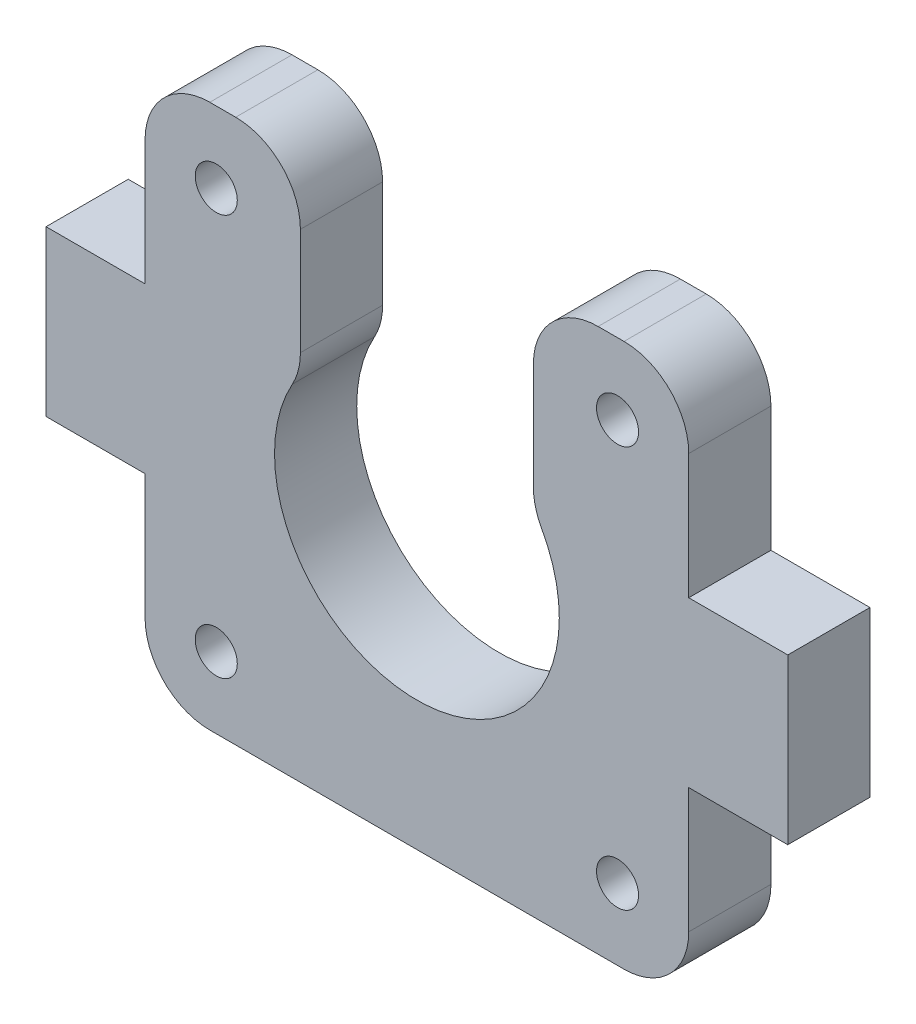
ISO-10303-21;
HEADER;
FILE_DESCRIPTION(('STEP AP214'),'2;1');
FILE_NAME('part.step','',(''),(''),'','','');
FILE_SCHEMA(('AUTOMOTIVE_DESIGN { 1 0 10303 214 1 1 1 1 }'));
ENDSEC;
DATA;
#1=APPLICATION_CONTEXT('core data for automotive mechanical design processes');
#2=APPLICATION_PROTOCOL_DEFINITION('international standard','automotive_design',2000,#1);
#3=PRODUCT_CONTEXT('',#1,'mechanical');
#4=PRODUCT('Part','Part','',(#3));
#5=PRODUCT_RELATED_PRODUCT_CATEGORY('part','',(#4));
#6=PRODUCT_DEFINITION_FORMATION('','',#4);
#7=PRODUCT_DEFINITION_CONTEXT('part definition',#1,'design');
#8=PRODUCT_DEFINITION('design','',#6,#7);
#9=PRODUCT_DEFINITION_SHAPE('','',#8);
#10=(LENGTH_UNIT() NAMED_UNIT(*) SI_UNIT(.MILLI.,.METRE.));
#11=(NAMED_UNIT(*) PLANE_ANGLE_UNIT() SI_UNIT($,.RADIAN.));
#12=(NAMED_UNIT(*) SI_UNIT($,.STERADIAN.) SOLID_ANGLE_UNIT());
#13=UNCERTAINTY_MEASURE_WITH_UNIT(LENGTH_MEASURE(1.E-05),#10,'distance_accuracy_value','');
#14=(GEOMETRIC_REPRESENTATION_CONTEXT(3) GLOBAL_UNCERTAINTY_ASSIGNED_CONTEXT((#13)) GLOBAL_UNIT_ASSIGNED_CONTEXT((#10,
#11,#12)) REPRESENTATION_CONTEXT('',''));
#15=CARTESIAN_POINT('',(0.,0.,0.));
#16=DIRECTION('',(0.,0.,1.));
#17=DIRECTION('',(1.,0.,0.));
#18=AXIS2_PLACEMENT_3D('',#15,#16,#17);
#19=CARTESIAN_POINT('',(0.,0.,6.35));
#20=DIRECTION('',(0.,0.,1.));
#21=DIRECTION('',(1.,0.,0.));
#22=AXIS2_PLACEMENT_3D('',#19,#20,#21);
#23=PLANE('',#22);
#24=CARTESIAN_POINT('',(15.5,15.5,6.35));
#25=DIRECTION('',(0.,0.,1.));
#26=DIRECTION('',(1.,0.,0.));
#27=AXIS2_PLACEMENT_3D('',#24,#25,#26);
#28=CIRCLE('',#27,1.625);
#29=CARTESIAN_POINT('',(17.125,15.5,6.35));
#30=VERTEX_POINT('',#29);
#31=EDGE_CURVE('E279',#30,#30,#28,.T.);
#32=ORIENTED_EDGE('',*,*,#31,.F.);
#33=EDGE_LOOP('',(#32));
#34=FACE_BOUND('',#33,.T.);
#35=CARTESIAN_POINT('',(15.5,-15.5,6.35));
#36=DIRECTION('',(0.,0.,1.));
#37=DIRECTION('',(1.,0.,0.));
#38=AXIS2_PLACEMENT_3D('',#35,#36,#37);
#39=CIRCLE('',#38,1.625);
#40=CARTESIAN_POINT('',(17.125,-15.5,6.35));
#41=VERTEX_POINT('',#40);
#42=EDGE_CURVE('E291',#41,#41,#39,.T.);
#43=ORIENTED_EDGE('',*,*,#42,.F.);
#44=EDGE_LOOP('',(#43));
#45=FACE_BOUND('',#44,.T.);
#46=CARTESIAN_POINT('',(-15.5,15.5,6.35));
#47=DIRECTION('',(0.,0.,1.));
#48=DIRECTION('',(1.,0.,0.));
#49=AXIS2_PLACEMENT_3D('',#46,#47,#48);
#50=CIRCLE('',#49,1.625);
#51=CARTESIAN_POINT('',(-13.875,15.5,6.35));
#52=VERTEX_POINT('',#51);
#53=EDGE_CURVE('E297',#52,#52,#50,.T.);
#54=ORIENTED_EDGE('',*,*,#53,.F.);
#55=EDGE_LOOP('',(#54));
#56=FACE_BOUND('',#55,.T.);
#57=CARTESIAN_POINT('',(-15.5,-15.5,6.35));
#58=DIRECTION('',(0.,0.,1.));
#59=DIRECTION('',(1.,0.,0.));
#60=AXIS2_PLACEMENT_3D('',#57,#58,#59);
#61=CIRCLE('',#60,1.625);
#62=CARTESIAN_POINT('',(-13.875,-15.5,6.35));
#63=VERTEX_POINT('',#62);
#64=EDGE_CURVE('E303',#63,#63,#61,.T.);
#65=ORIENTED_EDGE('',*,*,#64,.F.);
#66=EDGE_LOOP('',(#65));
#67=FACE_BOUND('',#66,.T.);
#68=DIRECTION('',(-1.,0.,0.));
#69=VECTOR('',#68,1.);
#70=CARTESIAN_POINT('',(28.65,21.,6.35));
#71=LINE('',#70,#69);
#72=CARTESIAN_POINT('',(16.,21.,6.35));
#73=VERTEX_POINT('',#72);
#74=CARTESIAN_POINT('',(14.,21.,6.35));
#75=VERTEX_POINT('',#74);
#76=EDGE_CURVE('E323',#73,#75,#71,.T.);
#77=ORIENTED_EDGE('',*,*,#76,.T.);
#78=CARTESIAN_POINT('',(14.,16.,6.35));
#79=DIRECTION('',(0.,0.,1.));
#80=DIRECTION('',(1.,0.,0.));
#81=AXIS2_PLACEMENT_3D('',#78,#79,#80);
#82=CIRCLE('',#81,5.);
#83=CARTESIAN_POINT('',(9.,16.,6.35));
#84=VERTEX_POINT('',#83);
#85=EDGE_CURVE('E353',#75,#84,#82,.T.);
#86=ORIENTED_EDGE('',*,*,#85,.T.);
#87=DIRECTION('',(0.,1.,0.));
#88=VECTOR('',#87,1.);
#89=CARTESIAN_POINT('',(9.,0.,6.35));
#90=LINE('',#89,#88);
#91=CARTESIAN_POINT('',(9.,7.74596669241484,6.35));
#92=VERTEX_POINT('',#91);
#93=EDGE_CURVE('E281',#92,#84,#90,.T.);
#94=ORIENTED_EDGE('',*,*,#93,.F.);
#95=CARTESIAN_POINT('',(14.,7.74596669241484,6.35));
#96=DIRECTION('',(0.,0.,1.));
#97=DIRECTION('',(1.,0.,0.));
#98=AXIS2_PLACEMENT_3D('',#95,#96,#97);
#99=CIRCLE('',#98,5.);
#100=CARTESIAN_POINT('',(9.625,5.3253521010352,6.35));
#101=VERTEX_POINT('',#100);
#102=EDGE_CURVE('E347',#92,#101,#99,.T.);
#103=ORIENTED_EDGE('',*,*,#102,.T.);
#104=CARTESIAN_POINT('',(0.,0.,6.35));
#105=DIRECTION('',(0.,0.,1.));
#106=DIRECTION('',(1.,0.,0.));
#107=AXIS2_PLACEMENT_3D('',#104,#105,#106);
#108=CIRCLE('',#107,11.);
#109=CARTESIAN_POINT('',(-9.625,5.3253521010352,6.35));
#110=VERTEX_POINT('',#109);
#111=EDGE_CURVE('E256',#110,#101,#108,.T.);
#112=ORIENTED_EDGE('',*,*,#111,.F.);
#113=CARTESIAN_POINT('',(-14.,7.74596669241484,6.35));
#114=DIRECTION('',(0.,0.,1.));
#115=DIRECTION('',(1.,0.,0.));
#116=AXIS2_PLACEMENT_3D('',#113,#114,#115);
#117=CIRCLE('',#116,5.);
#118=CARTESIAN_POINT('',(-9.,7.74596669241484,6.35));
#119=VERTEX_POINT('',#118);
#120=EDGE_CURVE('E349',#110,#119,#117,.T.);
#121=ORIENTED_EDGE('',*,*,#120,.T.);
#122=DIRECTION('',(0.,1.,0.));
#123=VECTOR('',#122,1.);
#124=CARTESIAN_POINT('',(-9.,0.,6.35));
#125=LINE('',#124,#123);
#126=CARTESIAN_POINT('',(-9.,16.,6.35));
#127=VERTEX_POINT('',#126);
#128=EDGE_CURVE('E274',#119,#127,#125,.T.);
#129=ORIENTED_EDGE('',*,*,#128,.T.);
#130=CARTESIAN_POINT('',(-14.,16.,6.35));
#131=DIRECTION('',(0.,0.,1.));
#132=DIRECTION('',(1.,0.,0.));
#133=AXIS2_PLACEMENT_3D('',#130,#131,#132);
#134=CIRCLE('',#133,5.);
#135=CARTESIAN_POINT('',(-14.,21.,6.35));
#136=VERTEX_POINT('',#135);
#137=EDGE_CURVE('E351',#127,#136,#134,.T.);
#138=ORIENTED_EDGE('',*,*,#137,.T.);
#139=CARTESIAN_POINT('',(-16.,21.,6.35));
#140=VERTEX_POINT('',#139);
#141=EDGE_CURVE('E320',#136,#140,#71,.T.);
#142=ORIENTED_EDGE('',*,*,#141,.T.);
#143=CARTESIAN_POINT('',(-16.,16.,6.35));
#144=DIRECTION('',(0.,0.,1.));
#145=DIRECTION('',(1.,0.,0.));
#146=AXIS2_PLACEMENT_3D('',#143,#144,#145);
#147=CIRCLE('',#146,5.);
#148=CARTESIAN_POINT('',(-21.,16.,6.35));
#149=VERTEX_POINT('',#148);
#150=EDGE_CURVE('E339',#140,#149,#147,.T.);
#151=ORIENTED_EDGE('',*,*,#150,.T.);
#152=DIRECTION('',(0.,1.,0.));
#153=VECTOR('',#152,1.);
#154=CARTESIAN_POINT('',(-21.,6.35,6.35));
#155=LINE('',#154,#153);
#156=CARTESIAN_POINT('',(-21.,6.35,6.35));
#157=VERTEX_POINT('',#156);
#158=EDGE_CURVE('E244',#157,#149,#155,.T.);
#159=ORIENTED_EDGE('',*,*,#158,.F.);
#160=DIRECTION('',(1.,0.,0.));
#161=VECTOR('',#160,1.);
#162=CARTESIAN_POINT('',(-21.,6.35,6.35));
#163=LINE('',#162,#161);
#164=CARTESIAN_POINT('',(-28.65,6.35,6.35));
#165=VERTEX_POINT('',#164);
#166=EDGE_CURVE('E248',#165,#157,#163,.T.);
#167=ORIENTED_EDGE('',*,*,#166,.F.);
#168=DIRECTION('',(0.,-1.,0.));
#169=VECTOR('',#168,1.);
#170=CARTESIAN_POINT('',(-28.65,-21.,6.35));
#171=LINE('',#170,#169);
#172=CARTESIAN_POINT('',(-28.65,-6.35,6.35));
#173=VERTEX_POINT('',#172);
#174=EDGE_CURVE('E310',#165,#173,#171,.T.);
#175=ORIENTED_EDGE('',*,*,#174,.T.);
#176=DIRECTION('',(-1.,0.,0.));
#177=VECTOR('',#176,1.);
#178=CARTESIAN_POINT('',(-28.65,-6.35,6.35));
#179=LINE('',#178,#177);
#180=CARTESIAN_POINT('',(-21.,-6.35,6.35));
#181=VERTEX_POINT('',#180);
#182=EDGE_CURVE('E261',#181,#173,#179,.T.);
#183=ORIENTED_EDGE('',*,*,#182,.F.);
#184=DIRECTION('',(0.,1.,0.));
#185=VECTOR('',#184,1.);
#186=CARTESIAN_POINT('',(-21.,-6.35,6.35));
#187=LINE('',#186,#185);
#188=CARTESIAN_POINT('',(-21.,-16.,6.35));
#189=VERTEX_POINT('',#188);
#190=EDGE_CURVE('E225',#189,#181,#187,.T.);
#191=ORIENTED_EDGE('',*,*,#190,.F.);
#192=CARTESIAN_POINT('',(-16.,-16.,6.35));
#193=DIRECTION('',(0.,0.,1.));
#194=DIRECTION('',(1.,0.,0.));
#195=AXIS2_PLACEMENT_3D('',#192,#193,#194);
#196=CIRCLE('',#195,5.);
#197=CARTESIAN_POINT('',(-16.,-21.,6.35));
#198=VERTEX_POINT('',#197);
#199=EDGE_CURVE('E345',#189,#198,#196,.T.);
#200=ORIENTED_EDGE('',*,*,#199,.T.);
#201=DIRECTION('',(1.,0.,0.));
#202=VECTOR('',#201,1.);
#203=CARTESIAN_POINT('',(28.65,-21.,6.35));
#204=LINE('',#203,#202);
#205=CARTESIAN_POINT('',(16.,-21.,6.35));
#206=VERTEX_POINT('',#205);
#207=EDGE_CURVE('E313',#198,#206,#204,.T.);
#208=ORIENTED_EDGE('',*,*,#207,.T.);
#209=CARTESIAN_POINT('',(16.,-16.,6.35));
#210=DIRECTION('',(0.,0.,1.));
#211=DIRECTION('',(1.,0.,0.));
#212=AXIS2_PLACEMENT_3D('',#209,#210,#211);
#213=CIRCLE('',#212,5.);
#214=CARTESIAN_POINT('',(21.,-16.,6.35));
#215=VERTEX_POINT('',#214);
#216=EDGE_CURVE('E343',#206,#215,#213,.T.);
#217=ORIENTED_EDGE('',*,*,#216,.T.);
#218=DIRECTION('',(0.,1.,0.));
#219=VECTOR('',#218,1.);
#220=CARTESIAN_POINT('',(21.,-6.35,6.35));
#221=LINE('',#220,#219);
#222=CARTESIAN_POINT('',(21.,-6.35,6.35));
#223=VERTEX_POINT('',#222);
#224=EDGE_CURVE('E233',#215,#223,#221,.T.);
#225=ORIENTED_EDGE('',*,*,#224,.T.);
#226=DIRECTION('',(1.,0.,0.));
#227=VECTOR('',#226,1.);
#228=CARTESIAN_POINT('',(28.65,-6.35,6.35));
#229=LINE('',#228,#227);
#230=CARTESIAN_POINT('',(28.65,-6.35,6.35));
#231=VERTEX_POINT('',#230);
#232=EDGE_CURVE('E230',#223,#231,#229,.T.);
#233=ORIENTED_EDGE('',*,*,#232,.T.);
#234=DIRECTION('',(0.,1.,0.));
#235=VECTOR('',#234,1.);
#236=CARTESIAN_POINT('',(28.65,-21.,6.35));
#237=LINE('',#236,#235);
#238=CARTESIAN_POINT('',(28.65,6.35,6.35));
#239=VERTEX_POINT('',#238);
#240=EDGE_CURVE('E317',#231,#239,#237,.T.);
#241=ORIENTED_EDGE('',*,*,#240,.T.);
#242=DIRECTION('',(-1.,0.,0.));
#243=VECTOR('',#242,1.);
#244=CARTESIAN_POINT('',(21.,6.35,6.35));
#245=LINE('',#244,#243);
#246=CARTESIAN_POINT('',(21.,6.35,6.35));
#247=VERTEX_POINT('',#246);
#248=EDGE_CURVE('E219',#239,#247,#245,.T.);
#249=ORIENTED_EDGE('',*,*,#248,.T.);
#250=DIRECTION('',(0.,1.,0.));
#251=VECTOR('',#250,1.);
#252=CARTESIAN_POINT('',(21.,6.35,6.35));
#253=LINE('',#252,#251);
#254=CARTESIAN_POINT('',(21.,16.,6.35));
#255=VERTEX_POINT('',#254);
#256=EDGE_CURVE('E214',#247,#255,#253,.T.);
#257=ORIENTED_EDGE('',*,*,#256,.T.);
#258=CARTESIAN_POINT('',(16.,16.,6.35));
#259=DIRECTION('',(0.,0.,1.));
#260=DIRECTION('',(1.,0.,0.));
#261=AXIS2_PLACEMENT_3D('',#258,#259,#260);
#262=CIRCLE('',#261,5.);
#263=EDGE_CURVE('E341',#255,#73,#262,.T.);
#264=ORIENTED_EDGE('',*,*,#263,.T.);
#265=EDGE_LOOP('',(#77,#86,#94,#103,#112,#121,#129,#138,#142,#151,#159,#167,#175,#183,#191,#200,
#208,#217,#225,#233,#241,#249,#257,#264));
#266=FACE_BOUND('',#265,.T.);
#267=ADVANCED_FACE('F35',(#34,#45,#56,#67,#266),#23,.T.);
#268=CARTESIAN_POINT('',(0.,0.,0.));
#269=DIRECTION('',(0.,0.,1.));
#270=DIRECTION('',(1.,0.,0.));
#271=AXIS2_PLACEMENT_3D('',#268,#269,#270);
#272=PLANE('',#271);
#273=CARTESIAN_POINT('',(-15.5,-15.5,0.));
#274=DIRECTION('',(0.,0.,1.));
#275=DIRECTION('',(1.,0.,0.));
#276=AXIS2_PLACEMENT_3D('',#273,#274,#275);
#277=CIRCLE('',#276,1.625);
#278=CARTESIAN_POINT('',(-13.875,-15.5,0.));
#279=VERTEX_POINT('',#278);
#280=EDGE_CURVE('E306',#279,#279,#277,.T.);
#281=ORIENTED_EDGE('',*,*,#280,.T.);
#282=EDGE_LOOP('',(#281));
#283=FACE_BOUND('',#282,.T.);
#284=CARTESIAN_POINT('',(-15.5,15.5,0.));
#285=DIRECTION('',(0.,0.,1.));
#286=DIRECTION('',(1.,0.,0.));
#287=AXIS2_PLACEMENT_3D('',#284,#285,#286);
#288=CIRCLE('',#287,1.625);
#289=CARTESIAN_POINT('',(-13.875,15.5,0.));
#290=VERTEX_POINT('',#289);
#291=EDGE_CURVE('E300',#290,#290,#288,.T.);
#292=ORIENTED_EDGE('',*,*,#291,.T.);
#293=EDGE_LOOP('',(#292));
#294=FACE_BOUND('',#293,.T.);
#295=CARTESIAN_POINT('',(15.5,-15.5,0.));
#296=DIRECTION('',(0.,0.,1.));
#297=DIRECTION('',(1.,0.,0.));
#298=AXIS2_PLACEMENT_3D('',#295,#296,#297);
#299=CIRCLE('',#298,1.625);
#300=CARTESIAN_POINT('',(17.125,-15.5,0.));
#301=VERTEX_POINT('',#300);
#302=EDGE_CURVE('E294',#301,#301,#299,.T.);
#303=ORIENTED_EDGE('',*,*,#302,.T.);
#304=EDGE_LOOP('',(#303));
#305=FACE_BOUND('',#304,.T.);
#306=CARTESIAN_POINT('',(15.5,15.5,0.));
#307=DIRECTION('',(0.,0.,1.));
#308=DIRECTION('',(1.,0.,0.));
#309=AXIS2_PLACEMENT_3D('',#306,#307,#308);
#310=CIRCLE('',#309,1.625);
#311=CARTESIAN_POINT('',(17.125,15.5,0.));
#312=VERTEX_POINT('',#311);
#313=EDGE_CURVE('E288',#312,#312,#310,.T.);
#314=ORIENTED_EDGE('',*,*,#313,.T.);
#315=EDGE_LOOP('',(#314));
#316=FACE_BOUND('',#315,.T.);
#317=DIRECTION('',(0.,1.,0.));
#318=VECTOR('',#317,1.);
#319=CARTESIAN_POINT('',(9.,0.,0.));
#320=LINE('',#319,#318);
#321=CARTESIAN_POINT('',(9.,7.74596669241484,0.));
#322=VERTEX_POINT('',#321);
#323=CARTESIAN_POINT('',(9.,16.,0.));
#324=VERTEX_POINT('',#323);
#325=EDGE_CURVE('E273',#322,#324,#320,.T.);
#326=ORIENTED_EDGE('',*,*,#325,.T.);
#327=CARTESIAN_POINT('',(14.,16.,0.));
#328=DIRECTION('',(0.,0.,1.));
#329=DIRECTION('',(1.,0.,0.));
#330=AXIS2_PLACEMENT_3D('',#327,#328,#329);
#331=CIRCLE('',#330,5.);
#332=CARTESIAN_POINT('',(14.,21.,0.));
#333=VERTEX_POINT('',#332);
#334=EDGE_CURVE('E373',#324,#333,#331,.F.);
#335=ORIENTED_EDGE('',*,*,#334,.T.);
#336=DIRECTION('',(-1.,0.,0.));
#337=VECTOR('',#336,1.);
#338=CARTESIAN_POINT('',(28.65,21.,0.));
#339=LINE('',#338,#337);
#340=CARTESIAN_POINT('',(16.,21.,0.));
#341=VERTEX_POINT('',#340);
#342=EDGE_CURVE('E314',#341,#333,#339,.T.);
#343=ORIENTED_EDGE('',*,*,#342,.F.);
#344=CARTESIAN_POINT('',(16.,16.,0.));
#345=DIRECTION('',(0.,0.,1.));
#346=DIRECTION('',(1.,0.,0.));
#347=AXIS2_PLACEMENT_3D('',#344,#345,#346);
#348=CIRCLE('',#347,5.);
#349=CARTESIAN_POINT('',(21.,16.,0.));
#350=VERTEX_POINT('',#349);
#351=EDGE_CURVE('E50',#341,#350,#348,.F.);
#352=ORIENTED_EDGE('',*,*,#351,.T.);
#353=DIRECTION('',(0.,1.,0.));
#354=VECTOR('',#353,1.);
#355=CARTESIAN_POINT('',(21.,6.35,0.));
#356=LINE('',#355,#354);
#357=CARTESIAN_POINT('',(21.,6.35,0.));
#358=VERTEX_POINT('',#357);
#359=EDGE_CURVE('E207',#358,#350,#356,.T.);
#360=ORIENTED_EDGE('',*,*,#359,.F.);
#361=DIRECTION('',(-1.,0.,0.));
#362=VECTOR('',#361,1.);
#363=CARTESIAN_POINT('',(21.,6.35,0.));
#364=LINE('',#363,#362);
#365=CARTESIAN_POINT('',(28.65,6.35,0.));
#366=VERTEX_POINT('',#365);
#367=EDGE_CURVE('E198',#366,#358,#364,.T.);
#368=ORIENTED_EDGE('',*,*,#367,.F.);
#369=DIRECTION('',(0.,1.,0.));
#370=VECTOR('',#369,1.);
#371=CARTESIAN_POINT('',(28.65,-21.,0.));
#372=LINE('',#371,#370);
#373=CARTESIAN_POINT('',(28.65,-6.35,0.));
#374=VERTEX_POINT('',#373);
#375=EDGE_CURVE('E329',#374,#366,#372,.T.);
#376=ORIENTED_EDGE('',*,*,#375,.F.);
#377=DIRECTION('',(1.,0.,0.));
#378=VECTOR('',#377,1.);
#379=CARTESIAN_POINT('',(28.65,-6.35,0.));
#380=LINE('',#379,#378);
#381=CARTESIAN_POINT('',(21.,-6.35,0.));
#382=VERTEX_POINT('',#381);
#383=EDGE_CURVE('E229',#382,#374,#380,.T.);
#384=ORIENTED_EDGE('',*,*,#383,.F.);
#385=DIRECTION('',(0.,1.,0.));
#386=VECTOR('',#385,1.);
#387=CARTESIAN_POINT('',(21.,-6.35,0.));
#388=LINE('',#387,#386);
#389=CARTESIAN_POINT('',(21.,-16.,0.));
#390=VERTEX_POINT('',#389);
#391=EDGE_CURVE('E227',#390,#382,#388,.T.);
#392=ORIENTED_EDGE('',*,*,#391,.F.);
#393=CARTESIAN_POINT('',(16.,-16.,0.));
#394=DIRECTION('',(0.,0.,1.));
#395=DIRECTION('',(1.,0.,0.));
#396=AXIS2_PLACEMENT_3D('',#393,#394,#395);
#397=CIRCLE('',#396,5.);
#398=CARTESIAN_POINT('',(16.,-21.,0.));
#399=VERTEX_POINT('',#398);
#400=EDGE_CURVE('E363',#390,#399,#397,.F.);
#401=ORIENTED_EDGE('',*,*,#400,.T.);
#402=DIRECTION('',(1.,0.,0.));
#403=VECTOR('',#402,1.);
#404=CARTESIAN_POINT('',(28.65,-21.,0.));
#405=LINE('',#404,#403);
#406=CARTESIAN_POINT('',(-16.,-21.,0.));
#407=VERTEX_POINT('',#406);
#408=EDGE_CURVE('E326',#407,#399,#405,.T.);
#409=ORIENTED_EDGE('',*,*,#408,.F.);
#410=CARTESIAN_POINT('',(-16.,-16.,0.));
#411=DIRECTION('',(0.,0.,1.));
#412=DIRECTION('',(1.,0.,0.));
#413=AXIS2_PLACEMENT_3D('',#410,#411,#412);
#414=CIRCLE('',#413,5.);
#415=CARTESIAN_POINT('',(-21.,-16.,0.));
#416=VERTEX_POINT('',#415);
#417=EDGE_CURVE('E365',#407,#416,#414,.F.);
#418=ORIENTED_EDGE('',*,*,#417,.T.);
#419=DIRECTION('',(0.,1.,0.));
#420=VECTOR('',#419,1.);
#421=CARTESIAN_POINT('',(-21.,-6.35,0.));
#422=LINE('',#421,#420);
#423=CARTESIAN_POINT('',(-21.,-6.35,0.));
#424=VERTEX_POINT('',#423);
#425=EDGE_CURVE('E258',#416,#424,#422,.T.);
#426=ORIENTED_EDGE('',*,*,#425,.T.);
#427=DIRECTION('',(-1.,0.,0.));
#428=VECTOR('',#427,1.);
#429=CARTESIAN_POINT('',(-28.65,-6.35,0.));
#430=LINE('',#429,#428);
#431=CARTESIAN_POINT('',(-28.65,-6.35,0.));
#432=VERTEX_POINT('',#431);
#433=EDGE_CURVE('E260',#424,#432,#430,.T.);
#434=ORIENTED_EDGE('',*,*,#433,.T.);
#435=DIRECTION('',(0.,-1.,0.));
#436=VECTOR('',#435,1.);
#437=CARTESIAN_POINT('',(-28.65,-21.,0.));
#438=LINE('',#437,#436);
#439=CARTESIAN_POINT('',(-28.65,6.35,0.));
#440=VERTEX_POINT('',#439);
#441=EDGE_CURVE('E309',#440,#432,#438,.T.);
#442=ORIENTED_EDGE('',*,*,#441,.F.);
#443=DIRECTION('',(1.,0.,0.));
#444=VECTOR('',#443,1.);
#445=CARTESIAN_POINT('',(-21.,6.35,0.));
#446=LINE('',#445,#444);
#447=CARTESIAN_POINT('',(-21.,6.35,0.));
#448=VERTEX_POINT('',#447);
#449=EDGE_CURVE('E240',#440,#448,#446,.T.);
#450=ORIENTED_EDGE('',*,*,#449,.T.);
#451=DIRECTION('',(0.,1.,0.));
#452=VECTOR('',#451,1.);
#453=CARTESIAN_POINT('',(-21.,6.35,0.));
#454=LINE('',#453,#452);
#455=CARTESIAN_POINT('',(-21.,16.,0.));
#456=VERTEX_POINT('',#455);
#457=EDGE_CURVE('E243',#448,#456,#454,.T.);
#458=ORIENTED_EDGE('',*,*,#457,.T.);
#459=CARTESIAN_POINT('',(-16.,16.,0.));
#460=DIRECTION('',(0.,0.,1.));
#461=DIRECTION('',(1.,0.,0.));
#462=AXIS2_PLACEMENT_3D('',#459,#460,#461);
#463=CIRCLE('',#462,5.);
#464=CARTESIAN_POINT('',(-16.,21.,0.));
#465=VERTEX_POINT('',#464);
#466=EDGE_CURVE('E360',#456,#465,#463,.F.);
#467=ORIENTED_EDGE('',*,*,#466,.T.);
#468=CARTESIAN_POINT('',(-14.,21.,0.));
#469=VERTEX_POINT('',#468);
#470=EDGE_CURVE('E331',#469,#465,#339,.T.);
#471=ORIENTED_EDGE('',*,*,#470,.F.);
#472=CARTESIAN_POINT('',(-14.,16.,0.));
#473=DIRECTION('',(0.,0.,1.));
#474=DIRECTION('',(1.,0.,0.));
#475=AXIS2_PLACEMENT_3D('',#472,#473,#474);
#476=CIRCLE('',#475,5.);
#477=CARTESIAN_POINT('',(-9.,16.,0.));
#478=VERTEX_POINT('',#477);
#479=EDGE_CURVE('E371',#469,#478,#476,.F.);
#480=ORIENTED_EDGE('',*,*,#479,.T.);
#481=DIRECTION('',(0.,1.,0.));
#482=VECTOR('',#481,1.);
#483=CARTESIAN_POINT('',(-9.,0.,0.));
#484=LINE('',#483,#482);
#485=CARTESIAN_POINT('',(-9.,7.74596669241484,0.));
#486=VERTEX_POINT('',#485);
#487=EDGE_CURVE('E276',#486,#478,#484,.T.);
#488=ORIENTED_EDGE('',*,*,#487,.F.);
#489=CARTESIAN_POINT('',(-14.,7.74596669241484,0.));
#490=DIRECTION('',(0.,0.,1.));
#491=DIRECTION('',(1.,0.,0.));
#492=AXIS2_PLACEMENT_3D('',#489,#490,#491);
#493=CIRCLE('',#492,5.);
#494=CARTESIAN_POINT('',(-9.625,5.3253521010352,0.));
#495=VERTEX_POINT('',#494);
#496=EDGE_CURVE('E369',#486,#495,#493,.F.);
#497=ORIENTED_EDGE('',*,*,#496,.T.);
#498=CARTESIAN_POINT('',(0.,0.,0.));
#499=DIRECTION('',(0.,0.,1.));
#500=DIRECTION('',(1.,0.,0.));
#501=AXIS2_PLACEMENT_3D('',#498,#499,#500);
#502=CIRCLE('',#501,11.);
#503=CARTESIAN_POINT('',(9.625,5.3253521010352,0.));
#504=VERTEX_POINT('',#503);
#505=EDGE_CURVE('E271',#495,#504,#502,.T.);
#506=ORIENTED_EDGE('',*,*,#505,.T.);
#507=CARTESIAN_POINT('',(14.,7.74596669241484,0.));
#508=DIRECTION('',(0.,0.,1.));
#509=DIRECTION('',(1.,0.,0.));
#510=AXIS2_PLACEMENT_3D('',#507,#508,#509);
#511=CIRCLE('',#510,5.);
#512=EDGE_CURVE('E367',#504,#322,#511,.F.);
#513=ORIENTED_EDGE('',*,*,#512,.T.);
#514=EDGE_LOOP('',(#326,#335,#343,#352,#360,#368,#376,#384,#392,#401,#409,#418,#426,#434,#442,
#450,#458,#467,#471,#480,#488,#497,#506,#513));
#515=FACE_BOUND('',#514,.T.);
#516=ADVANCED_FACE('F218',(#283,#294,#305,#316,#515),#272,.F.);
#517=CARTESIAN_POINT('',(28.65,-21.,6.35));
#518=DIRECTION('',(0.,1.,0.));
#519=DIRECTION('',(0.,0.,1.));
#520=AXIS2_PLACEMENT_3D('',#517,#518,#519);
#521=PLANE('',#520);
#522=ORIENTED_EDGE('',*,*,#207,.F.);
#523=DIRECTION('',(0.,0.,1.));
#524=VECTOR('',#523,1.);
#525=CARTESIAN_POINT('',(-16.,-21.,6.35));
#526=LINE('',#525,#524);
#527=EDGE_CURVE('E395',#198,#407,#526,.F.);
#528=ORIENTED_EDGE('',*,*,#527,.T.);
#529=ORIENTED_EDGE('',*,*,#408,.T.);
#530=DIRECTION('',(0.,0.,1.));
#531=VECTOR('',#530,1.);
#532=CARTESIAN_POINT('',(16.,-21.,6.35));
#533=LINE('',#532,#531);
#534=EDGE_CURVE('E392',#399,#206,#533,.T.);
#535=ORIENTED_EDGE('',*,*,#534,.T.);
#536=EDGE_LOOP('',(#522,#528,#529,#535));
#537=FACE_BOUND('',#536,.T.);
#538=ADVANCED_FACE('F424',(#537),#521,.F.);
#539=CARTESIAN_POINT('',(28.65,-21.,6.35));
#540=DIRECTION('',(-1.,0.,0.));
#541=DIRECTION('',(0.,0.,1.));
#542=AXIS2_PLACEMENT_3D('',#539,#540,#541);
#543=PLANE('',#542);
#544=DIRECTION('',(0.,0.,1.));
#545=VECTOR('',#544,1.);
#546=CARTESIAN_POINT('',(28.65,6.35,0.));
#547=LINE('',#546,#545);
#548=EDGE_CURVE('E204',#366,#239,#547,.T.);
#549=ORIENTED_EDGE('',*,*,#548,.T.);
#550=ORIENTED_EDGE('',*,*,#240,.F.);
#551=DIRECTION('',(0.,0.,1.));
#552=VECTOR('',#551,1.);
#553=CARTESIAN_POINT('',(28.65,-6.35,0.));
#554=LINE('',#553,#552);
#555=EDGE_CURVE('E232',#374,#231,#554,.T.);
#556=ORIENTED_EDGE('',*,*,#555,.F.);
#557=ORIENTED_EDGE('',*,*,#375,.T.);
#558=EDGE_LOOP('',(#549,#550,#556,#557));
#559=FACE_BOUND('',#558,.T.);
#560=ADVANCED_FACE('F404',(#559),#543,.F.);
#561=CARTESIAN_POINT('',(28.65,21.,6.35));
#562=DIRECTION('',(0.,-1.,0.));
#563=DIRECTION('',(1.,0.,0.));
#564=AXIS2_PLACEMENT_3D('',#561,#562,#563);
#565=PLANE('',#564);
#566=ORIENTED_EDGE('',*,*,#342,.T.);
#567=DIRECTION('',(0.,0.,1.));
#568=VECTOR('',#567,1.);
#569=CARTESIAN_POINT('',(14.,21.,6.35));
#570=LINE('',#569,#568);
#571=EDGE_CURVE('E336',#333,#75,#570,.T.);
#572=ORIENTED_EDGE('',*,*,#571,.T.);
#573=ORIENTED_EDGE('',*,*,#76,.F.);
#574=DIRECTION('',(0.,0.,1.));
#575=VECTOR('',#574,1.);
#576=CARTESIAN_POINT('',(16.,21.,0.));
#577=LINE('',#576,#575);
#578=EDGE_CURVE('E334',#73,#341,#577,.F.);
#579=ORIENTED_EDGE('',*,*,#578,.T.);
#580=EDGE_LOOP('',(#566,#572,#573,#579));
#581=FACE_BOUND('',#580,.T.);
#582=ADVANCED_FACE('F489',(#581),#565,.F.);
#583=ORIENTED_EDGE('',*,*,#141,.F.);
#584=DIRECTION('',(0.,0.,1.));
#585=VECTOR('',#584,1.);
#586=CARTESIAN_POINT('',(-14.,21.,0.));
#587=LINE('',#586,#585);
#588=EDGE_CURVE('E383',#136,#469,#587,.F.);
#589=ORIENTED_EDGE('',*,*,#588,.T.);
#590=ORIENTED_EDGE('',*,*,#470,.T.);
#591=DIRECTION('',(0.,0.,1.));
#592=VECTOR('',#591,1.);
#593=CARTESIAN_POINT('',(-16.,21.,6.35));
#594=LINE('',#593,#592);
#595=EDGE_CURVE('E380',#465,#140,#594,.T.);
#596=ORIENTED_EDGE('',*,*,#595,.T.);
#597=EDGE_LOOP('',(#583,#589,#590,#596));
#598=FACE_BOUND('',#597,.T.);
#599=ADVANCED_FACE('F458',(#598),#565,.F.);
#600=CARTESIAN_POINT('',(-28.65,-21.,6.35));
#601=DIRECTION('',(1.,0.,0.));
#602=DIRECTION('',(0.,0.,-1.));
#603=AXIS2_PLACEMENT_3D('',#600,#601,#602);
#604=PLANE('',#603);
#605=ORIENTED_EDGE('',*,*,#174,.F.);
#606=DIRECTION('',(0.,0.,1.));
#607=VECTOR('',#606,1.);
#608=CARTESIAN_POINT('',(-28.65,6.35,0.));
#609=LINE('',#608,#607);
#610=EDGE_CURVE('E247',#440,#165,#609,.T.);
#611=ORIENTED_EDGE('',*,*,#610,.F.);
#612=ORIENTED_EDGE('',*,*,#441,.T.);
#613=DIRECTION('',(0.,0.,1.));
#614=VECTOR('',#613,1.);
#615=CARTESIAN_POINT('',(-28.65,-6.35,0.));
#616=LINE('',#615,#614);
#617=EDGE_CURVE('E251',#432,#173,#616,.T.);
#618=ORIENTED_EDGE('',*,*,#617,.T.);
#619=EDGE_LOOP('',(#605,#611,#612,#618));
#620=FACE_BOUND('',#619,.T.);
#621=ADVANCED_FACE('F442',(#620),#604,.F.);
#622=CARTESIAN_POINT('',(-15.5,-15.5,6.35));
#623=DIRECTION('',(0.,0.,1.));
#624=DIRECTION('',(1.,0.,0.));
#625=AXIS2_PLACEMENT_3D('',#622,#623,#624);
#626=CYLINDRICAL_SURFACE('',#625,1.625);
#627=ORIENTED_EDGE('',*,*,#280,.F.);
#628=EDGE_LOOP('',(#627));
#629=FACE_BOUND('',#628,.T.);
#630=ORIENTED_EDGE('',*,*,#64,.T.);
#631=EDGE_LOOP('',(#630));
#632=FACE_BOUND('',#631,.T.);
#633=ADVANCED_FACE('F509',(#629,#632),#626,.F.);
#634=CARTESIAN_POINT('',(-15.5,15.5,6.35));
#635=DIRECTION('',(0.,0.,1.));
#636=DIRECTION('',(1.,0.,0.));
#637=AXIS2_PLACEMENT_3D('',#634,#635,#636);
#638=CYLINDRICAL_SURFACE('',#637,1.625);
#639=ORIENTED_EDGE('',*,*,#291,.F.);
#640=EDGE_LOOP('',(#639));
#641=FACE_BOUND('',#640,.T.);
#642=ORIENTED_EDGE('',*,*,#53,.T.);
#643=EDGE_LOOP('',(#642));
#644=FACE_BOUND('',#643,.T.);
#645=ADVANCED_FACE('F696',(#641,#644),#638,.F.);
#646=CARTESIAN_POINT('',(15.5,-15.5,6.35));
#647=DIRECTION('',(0.,0.,1.));
#648=DIRECTION('',(1.,0.,0.));
#649=AXIS2_PLACEMENT_3D('',#646,#647,#648);
#650=CYLINDRICAL_SURFACE('',#649,1.625);
#651=ORIENTED_EDGE('',*,*,#302,.F.);
#652=EDGE_LOOP('',(#651));
#653=FACE_BOUND('',#652,.T.);
#654=ORIENTED_EDGE('',*,*,#42,.T.);
#655=EDGE_LOOP('',(#654));
#656=FACE_BOUND('',#655,.T.);
#657=ADVANCED_FACE('F687',(#653,#656),#650,.F.);
#658=CARTESIAN_POINT('',(15.5,15.5,6.35));
#659=DIRECTION('',(0.,0.,1.));
#660=DIRECTION('',(1.,0.,0.));
#661=AXIS2_PLACEMENT_3D('',#658,#659,#660);
#662=CYLINDRICAL_SURFACE('',#661,1.625);
#663=ORIENTED_EDGE('',*,*,#313,.F.);
#664=EDGE_LOOP('',(#663));
#665=FACE_BOUND('',#664,.T.);
#666=ORIENTED_EDGE('',*,*,#31,.T.);
#667=EDGE_LOOP('',(#666));
#668=FACE_BOUND('',#667,.T.);
#669=ADVANCED_FACE('F674',(#665,#668),#662,.F.);
#670=CARTESIAN_POINT('',(0.,0.,0.));
#671=DIRECTION('',(0.,0.,1.));
#672=DIRECTION('',(1.,0.,0.));
#673=AXIS2_PLACEMENT_3D('',#670,#671,#672);
#674=CYLINDRICAL_SURFACE('',#673,11.);
#675=ORIENTED_EDGE('',*,*,#505,.F.);
#676=DIRECTION('',(0.,0.,1.));
#677=VECTOR('',#676,1.);
#678=CARTESIAN_POINT('',(-9.625,5.3253521010352,0.));
#679=LINE('',#678,#677);
#680=EDGE_CURVE('E386',#495,#110,#679,.T.);
#681=ORIENTED_EDGE('',*,*,#680,.T.);
#682=ORIENTED_EDGE('',*,*,#111,.T.);
#683=DIRECTION('',(0.,0.,1.));
#684=VECTOR('',#683,1.);
#685=CARTESIAN_POINT('',(9.625,5.3253521010352,0.));
#686=LINE('',#685,#684);
#687=EDGE_CURVE('E58',#101,#504,#686,.F.);
#688=ORIENTED_EDGE('',*,*,#687,.T.);
#689=EDGE_LOOP('',(#675,#681,#682,#688));
#690=FACE_BOUND('',#689,.T.);
#691=ADVANCED_FACE('F473',(#690),#674,.F.);
#692=CARTESIAN_POINT('',(-9.,0.,0.));
#693=DIRECTION('',(1.,0.,0.));
#694=DIRECTION('',(0.,0.,-1.));
#695=AXIS2_PLACEMENT_3D('',#692,#693,#694);
#696=PLANE('',#695);
#697=ORIENTED_EDGE('',*,*,#487,.T.);
#698=DIRECTION('',(0.,0.,1.));
#699=VECTOR('',#698,1.);
#700=CARTESIAN_POINT('',(-9.,16.,6.35));
#701=LINE('',#700,#699);
#702=EDGE_CURVE('E377',#478,#127,#701,.T.);
#703=ORIENTED_EDGE('',*,*,#702,.T.);
#704=ORIENTED_EDGE('',*,*,#128,.F.);
#705=DIRECTION('',(0.,0.,-1.));
#706=VECTOR('',#705,1.);
#707=CARTESIAN_POINT('',(-9.,7.74596669241484,0.));
#708=LINE('',#707,#706);
#709=EDGE_CURVE('E375',#119,#486,#708,.T.);
#710=ORIENTED_EDGE('',*,*,#709,.T.);
#711=EDGE_LOOP('',(#697,#703,#704,#710));
#712=FACE_BOUND('',#711,.T.);
#713=ADVANCED_FACE('F466',(#712),#696,.T.);
#714=CARTESIAN_POINT('',(9.,0.,0.));
#715=DIRECTION('',(1.,0.,0.));
#716=DIRECTION('',(0.,0.,-1.));
#717=AXIS2_PLACEMENT_3D('',#714,#715,#716);
#718=PLANE('',#717);
#719=ORIENTED_EDGE('',*,*,#93,.T.);
#720=DIRECTION('',(0.,0.,1.));
#721=VECTOR('',#720,1.);
#722=CARTESIAN_POINT('',(9.,16.,0.));
#723=LINE('',#722,#721);
#724=EDGE_CURVE('E358',#84,#324,#723,.F.);
#725=ORIENTED_EDGE('',*,*,#724,.T.);
#726=ORIENTED_EDGE('',*,*,#325,.F.);
#727=DIRECTION('',(0.,0.,1.));
#728=VECTOR('',#727,1.);
#729=CARTESIAN_POINT('',(9.,7.74596669241484,0.));
#730=LINE('',#729,#728);
#731=EDGE_CURVE('E355',#322,#92,#730,.T.);
#732=ORIENTED_EDGE('',*,*,#731,.T.);
#733=EDGE_LOOP('',(#719,#725,#726,#732));
#734=FACE_BOUND('',#733,.T.);
#735=ADVANCED_FACE('F481',(#734),#718,.F.);
#736=CARTESIAN_POINT('',(-21.,-6.35,0.));
#737=DIRECTION('',(1.,0.,0.));
#738=DIRECTION('',(0.,1.,0.));
#739=AXIS2_PLACEMENT_3D('',#736,#737,#738);
#740=PLANE('',#739);
#741=ORIENTED_EDGE('',*,*,#425,.F.);
#742=DIRECTION('',(0.,0.,1.));
#743=VECTOR('',#742,1.);
#744=CARTESIAN_POINT('',(-21.,-16.,0.));
#745=LINE('',#744,#743);
#746=EDGE_CURVE('E389',#416,#189,#745,.T.);
#747=ORIENTED_EDGE('',*,*,#746,.T.);
#748=ORIENTED_EDGE('',*,*,#190,.T.);
#749=DIRECTION('',(0.,0.,1.));
#750=VECTOR('',#749,1.);
#751=CARTESIAN_POINT('',(-21.,-6.35,0.));
#752=LINE('',#751,#750);
#753=EDGE_CURVE('E264',#424,#181,#752,.T.);
#754=ORIENTED_EDGE('',*,*,#753,.F.);
#755=EDGE_LOOP('',(#741,#747,#748,#754));
#756=FACE_BOUND('',#755,.T.);
#757=ADVANCED_FACE('F432',(#756),#740,.F.);
#758=CARTESIAN_POINT('',(-28.65,-6.35,0.));
#759=DIRECTION('',(0.,1.,0.));
#760=DIRECTION('',(0.,0.,1.));
#761=AXIS2_PLACEMENT_3D('',#758,#759,#760);
#762=PLANE('',#761);
#763=ORIENTED_EDGE('',*,*,#182,.T.);
#764=ORIENTED_EDGE('',*,*,#617,.F.);
#765=ORIENTED_EDGE('',*,*,#433,.F.);
#766=ORIENTED_EDGE('',*,*,#753,.T.);
#767=EDGE_LOOP('',(#763,#764,#765,#766));
#768=FACE_BOUND('',#767,.T.);
#769=ADVANCED_FACE('F437',(#768),#762,.F.);
#770=CARTESIAN_POINT('',(-21.,6.35,0.));
#771=DIRECTION('',(1.,0.,0.));
#772=DIRECTION('',(0.,0.,-1.));
#773=AXIS2_PLACEMENT_3D('',#770,#771,#772);
#774=PLANE('',#773);
#775=ORIENTED_EDGE('',*,*,#158,.T.);
#776=DIRECTION('',(0.,0.,1.));
#777=VECTOR('',#776,1.);
#778=CARTESIAN_POINT('',(-21.,16.,0.));
#779=LINE('',#778,#777);
#780=EDGE_CURVE('E11',#149,#456,#779,.F.);
#781=ORIENTED_EDGE('',*,*,#780,.T.);
#782=ORIENTED_EDGE('',*,*,#457,.F.);
#783=DIRECTION('',(0.,0.,1.));
#784=VECTOR('',#783,1.);
#785=CARTESIAN_POINT('',(-21.,6.35,0.));
#786=LINE('',#785,#784);
#787=EDGE_CURVE('E254',#448,#157,#786,.T.);
#788=ORIENTED_EDGE('',*,*,#787,.T.);
#789=EDGE_LOOP('',(#775,#781,#782,#788));
#790=FACE_BOUND('',#789,.T.);
#791=ADVANCED_FACE('F449',(#790),#774,.F.);
#792=CARTESIAN_POINT('',(-21.,6.35,0.));
#793=DIRECTION('',(0.,-1.,0.));
#794=DIRECTION('',(0.,0.,-1.));
#795=AXIS2_PLACEMENT_3D('',#792,#793,#794);
#796=PLANE('',#795);
#797=ORIENTED_EDGE('',*,*,#166,.T.);
#798=ORIENTED_EDGE('',*,*,#787,.F.);
#799=ORIENTED_EDGE('',*,*,#449,.F.);
#800=ORIENTED_EDGE('',*,*,#610,.T.);
#801=EDGE_LOOP('',(#797,#798,#799,#800));
#802=FACE_BOUND('',#801,.T.);
#803=ADVANCED_FACE('F445',(#802),#796,.F.);
#804=CARTESIAN_POINT('',(21.,6.35,0.));
#805=DIRECTION('',(0.,1.,0.));
#806=DIRECTION('',(0.,0.,1.));
#807=AXIS2_PLACEMENT_3D('',#804,#805,#806);
#808=PLANE('',#807);
#809=ORIENTED_EDGE('',*,*,#248,.F.);
#810=ORIENTED_EDGE('',*,*,#548,.F.);
#811=ORIENTED_EDGE('',*,*,#367,.T.);
#812=DIRECTION('',(0.,0.,1.));
#813=VECTOR('',#812,1.);
#814=CARTESIAN_POINT('',(21.,6.35,0.));
#815=LINE('',#814,#813);
#816=EDGE_CURVE('E201',#358,#247,#815,.T.);
#817=ORIENTED_EDGE('',*,*,#816,.T.);
#818=EDGE_LOOP('',(#809,#810,#811,#817));
#819=FACE_BOUND('',#818,.T.);
#820=ADVANCED_FACE('F200',(#819),#808,.T.);
#821=CARTESIAN_POINT('',(21.,6.35,0.));
#822=DIRECTION('',(1.,0.,0.));
#823=DIRECTION('',(0.,0.,-1.));
#824=AXIS2_PLACEMENT_3D('',#821,#822,#823);
#825=PLANE('',#824);
#826=ORIENTED_EDGE('',*,*,#359,.T.);
#827=DIRECTION('',(0.,0.,1.));
#828=VECTOR('',#827,1.);
#829=CARTESIAN_POINT('',(21.,16.,6.35));
#830=LINE('',#829,#828);
#831=EDGE_CURVE('E43',#350,#255,#830,.T.);
#832=ORIENTED_EDGE('',*,*,#831,.T.);
#833=ORIENTED_EDGE('',*,*,#256,.F.);
#834=ORIENTED_EDGE('',*,*,#816,.F.);
#835=EDGE_LOOP('',(#826,#832,#833,#834));
#836=FACE_BOUND('',#835,.T.);
#837=ADVANCED_FACE('F210',(#836),#825,.T.);
#838=CARTESIAN_POINT('',(21.,-6.35,0.));
#839=DIRECTION('',(1.,0.,0.));
#840=DIRECTION('',(0.,1.,0.));
#841=AXIS2_PLACEMENT_3D('',#838,#839,#840);
#842=PLANE('',#841);
#843=ORIENTED_EDGE('',*,*,#224,.F.);
#844=DIRECTION('',(0.,0.,1.));
#845=VECTOR('',#844,1.);
#846=CARTESIAN_POINT('',(21.,-16.,0.));
#847=LINE('',#846,#845);
#848=EDGE_CURVE('E397',#215,#390,#847,.F.);
#849=ORIENTED_EDGE('',*,*,#848,.T.);
#850=ORIENTED_EDGE('',*,*,#391,.T.);
#851=DIRECTION('',(0.,0.,1.));
#852=VECTOR('',#851,1.);
#853=CARTESIAN_POINT('',(21.,-6.35,0.));
#854=LINE('',#853,#852);
#855=EDGE_CURVE('E223',#382,#223,#854,.T.);
#856=ORIENTED_EDGE('',*,*,#855,.T.);
#857=EDGE_LOOP('',(#843,#849,#850,#856));
#858=FACE_BOUND('',#857,.T.);
#859=ADVANCED_FACE('F415',(#858),#842,.T.);
#860=CARTESIAN_POINT('',(28.65,-6.35,0.));
#861=DIRECTION('',(0.,-1.,0.));
#862=DIRECTION('',(0.,0.,-1.));
#863=AXIS2_PLACEMENT_3D('',#860,#861,#862);
#864=PLANE('',#863);
#865=ORIENTED_EDGE('',*,*,#232,.F.);
#866=ORIENTED_EDGE('',*,*,#855,.F.);
#867=ORIENTED_EDGE('',*,*,#383,.T.);
#868=ORIENTED_EDGE('',*,*,#555,.T.);
#869=EDGE_LOOP('',(#865,#866,#867,#868));
#870=FACE_BOUND('',#869,.T.);
#871=ADVANCED_FACE('F412',(#870),#864,.T.);
#872=CARTESIAN_POINT('',(14.,16.,6.35));
#873=DIRECTION('',(0.,0.,1.));
#874=DIRECTION('',(1.,0.,0.));
#875=AXIS2_PLACEMENT_3D('',#872,#873,#874);
#876=CYLINDRICAL_SURFACE('',#875,5.);
#877=ORIENTED_EDGE('',*,*,#334,.F.);
#878=ORIENTED_EDGE('',*,*,#724,.F.);
#879=ORIENTED_EDGE('',*,*,#85,.F.);
#880=ORIENTED_EDGE('',*,*,#571,.F.);
#881=EDGE_LOOP('',(#877,#878,#879,#880));
#882=FACE_BOUND('',#881,.T.);
#883=ADVANCED_FACE('F487',(#882),#876,.T.);
#884=CARTESIAN_POINT('',(-14.,16.,0.));
#885=DIRECTION('',(0.,0.,-1.));
#886=DIRECTION('',(-1.,0.,0.));
#887=AXIS2_PLACEMENT_3D('',#884,#885,#886);
#888=CYLINDRICAL_SURFACE('',#887,5.);
#889=ORIENTED_EDGE('',*,*,#479,.F.);
#890=ORIENTED_EDGE('',*,*,#588,.F.);
#891=ORIENTED_EDGE('',*,*,#137,.F.);
#892=ORIENTED_EDGE('',*,*,#702,.F.);
#893=EDGE_LOOP('',(#889,#890,#891,#892));
#894=FACE_BOUND('',#893,.T.);
#895=ADVANCED_FACE('F461',(#894),#888,.T.);
#896=CARTESIAN_POINT('',(-14.,7.74596669241484,0.));
#897=DIRECTION('',(0.,0.,1.));
#898=DIRECTION('',(1.,0.,0.));
#899=AXIS2_PLACEMENT_3D('',#896,#897,#898);
#900=CYLINDRICAL_SURFACE('',#899,5.);
#901=ORIENTED_EDGE('',*,*,#496,.F.);
#902=ORIENTED_EDGE('',*,*,#709,.F.);
#903=ORIENTED_EDGE('',*,*,#120,.F.);
#904=ORIENTED_EDGE('',*,*,#680,.F.);
#905=EDGE_LOOP('',(#901,#902,#903,#904));
#906=FACE_BOUND('',#905,.T.);
#907=ADVANCED_FACE('F470',(#906),#900,.T.);
#908=CARTESIAN_POINT('',(14.,7.74596669241484,0.));
#909=DIRECTION('',(0.,0.,1.));
#910=DIRECTION('',(1.,0.,0.));
#911=AXIS2_PLACEMENT_3D('',#908,#909,#910);
#912=CYLINDRICAL_SURFACE('',#911,5.);
#913=ORIENTED_EDGE('',*,*,#512,.F.);
#914=ORIENTED_EDGE('',*,*,#687,.F.);
#915=ORIENTED_EDGE('',*,*,#102,.F.);
#916=ORIENTED_EDGE('',*,*,#731,.F.);
#917=EDGE_LOOP('',(#913,#914,#915,#916));
#918=FACE_BOUND('',#917,.T.);
#919=ADVANCED_FACE('F478',(#918),#912,.T.);
#920=CARTESIAN_POINT('',(-16.,-16.,0.));
#921=DIRECTION('',(0.,0.,1.));
#922=DIRECTION('',(1.,0.,0.));
#923=AXIS2_PLACEMENT_3D('',#920,#921,#922);
#924=CYLINDRICAL_SURFACE('',#923,5.);
#925=ORIENTED_EDGE('',*,*,#417,.F.);
#926=ORIENTED_EDGE('',*,*,#527,.F.);
#927=ORIENTED_EDGE('',*,*,#199,.F.);
#928=ORIENTED_EDGE('',*,*,#746,.F.);
#929=EDGE_LOOP('',(#925,#926,#927,#928));
#930=FACE_BOUND('',#929,.T.);
#931=ADVANCED_FACE('F427',(#930),#924,.T.);
#932=CARTESIAN_POINT('',(16.,-16.,6.35));
#933=DIRECTION('',(0.,0.,-1.));
#934=DIRECTION('',(-1.,0.,0.));
#935=AXIS2_PLACEMENT_3D('',#932,#933,#934);
#936=CYLINDRICAL_SURFACE('',#935,5.);
#937=ORIENTED_EDGE('',*,*,#400,.F.);
#938=ORIENTED_EDGE('',*,*,#848,.F.);
#939=ORIENTED_EDGE('',*,*,#216,.F.);
#940=ORIENTED_EDGE('',*,*,#534,.F.);
#941=EDGE_LOOP('',(#937,#938,#939,#940));
#942=FACE_BOUND('',#941,.T.);
#943=ADVANCED_FACE('F418',(#942),#936,.T.);
#944=CARTESIAN_POINT('',(16.,16.,0.));
#945=DIRECTION('',(0.,0.,-1.));
#946=DIRECTION('',(-1.,0.,0.));
#947=AXIS2_PLACEMENT_3D('',#944,#945,#946);
#948=CYLINDRICAL_SURFACE('',#947,5.);
#949=ORIENTED_EDGE('',*,*,#351,.F.);
#950=ORIENTED_EDGE('',*,*,#578,.F.);
#951=ORIENTED_EDGE('',*,*,#263,.F.);
#952=ORIENTED_EDGE('',*,*,#831,.F.);
#953=EDGE_LOOP('',(#949,#950,#951,#952));
#954=FACE_BOUND('',#953,.T.);
#955=ADVANCED_FACE('F491',(#954),#948,.T.);
#956=CARTESIAN_POINT('',(-16.,16.,6.35));
#957=DIRECTION('',(0.,0.,1.));
#958=DIRECTION('',(1.,0.,0.));
#959=AXIS2_PLACEMENT_3D('',#956,#957,#958);
#960=CYLINDRICAL_SURFACE('',#959,5.);
#961=ORIENTED_EDGE('',*,*,#466,.F.);
#962=ORIENTED_EDGE('',*,*,#780,.F.);
#963=ORIENTED_EDGE('',*,*,#150,.F.);
#964=ORIENTED_EDGE('',*,*,#595,.F.);
#965=EDGE_LOOP('',(#961,#962,#963,#964));
#966=FACE_BOUND('',#965,.T.);
#967=ADVANCED_FACE('F37',(#966),#960,.T.);
#968=CLOSED_SHELL('',(#267,#516,#538,#560,#582,#599,#621,#633,#645,#657,#669,#691,#713,#735,
#757,#769,#791,#803,#820,#837,#859,#871,#883,#895,#907,#919,#931,#943,#955,#967));
#969=MANIFOLD_SOLID_BREP('B2',#968);
#970=ADVANCED_BREP_SHAPE_REPRESENTATION('',(#18,#969),#14);
#971=SHAPE_DEFINITION_REPRESENTATION(#9,#970);
ENDSEC;
END-ISO-10303-21;
